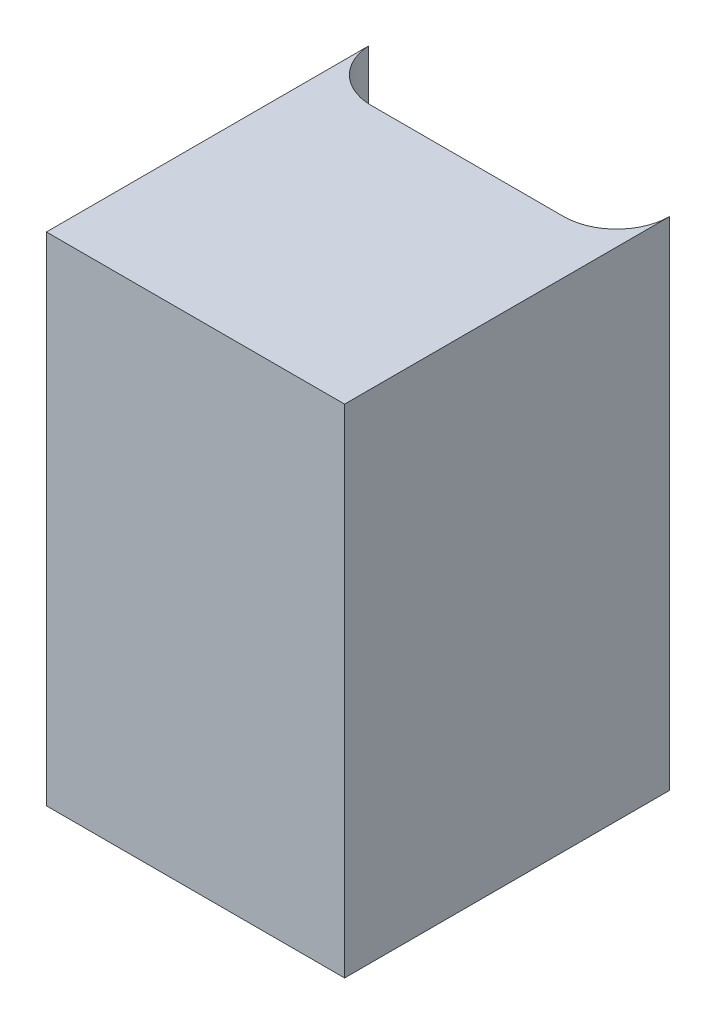
ISO-10303-21;
HEADER;
FILE_DESCRIPTION(('STEP AP214'),'2;1');
FILE_NAME('part.step','',(''),(''),'','','');
FILE_SCHEMA(('AUTOMOTIVE_DESIGN { 1 0 10303 214 1 1 1 1 }'));
ENDSEC;
DATA;
#1=APPLICATION_CONTEXT('core data for automotive mechanical design processes');
#2=APPLICATION_PROTOCOL_DEFINITION('international standard','automotive_design',2000,#1);
#3=PRODUCT_CONTEXT('',#1,'mechanical');
#4=PRODUCT('Part','Part','',(#3));
#5=PRODUCT_RELATED_PRODUCT_CATEGORY('part','',(#4));
#6=PRODUCT_DEFINITION_FORMATION('','',#4);
#7=PRODUCT_DEFINITION_CONTEXT('part definition',#1,'design');
#8=PRODUCT_DEFINITION('design','',#6,#7);
#9=PRODUCT_DEFINITION_SHAPE('','',#8);
#10=(LENGTH_UNIT() NAMED_UNIT(*) SI_UNIT(.MILLI.,.METRE.));
#11=(NAMED_UNIT(*) PLANE_ANGLE_UNIT() SI_UNIT($,.RADIAN.));
#12=(NAMED_UNIT(*) SI_UNIT($,.STERADIAN.) SOLID_ANGLE_UNIT());
#13=UNCERTAINTY_MEASURE_WITH_UNIT(LENGTH_MEASURE(1.E-05),#10,'distance_accuracy_value','');
#14=(GEOMETRIC_REPRESENTATION_CONTEXT(3) GLOBAL_UNCERTAINTY_ASSIGNED_CONTEXT((#13)) GLOBAL_UNIT_ASSIGNED_CONTEXT((#10,
#11,#12)) REPRESENTATION_CONTEXT('',''));
#15=CARTESIAN_POINT('',(0.,0.,0.));
#16=DIRECTION('',(0.,0.,1.));
#17=DIRECTION('',(1.,0.,0.));
#18=AXIS2_PLACEMENT_3D('',#15,#16,#17);
#19=CARTESIAN_POINT('',(18.,8.25056753821846,0.));
#20=DIRECTION('',(0.,-1.,0.));
#21=DIRECTION('',(0.,0.,-1.));
#22=AXIS2_PLACEMENT_3D('',#19,#20,#21);
#23=PLANE('',#22);
#24=DIRECTION('',(0.,0.,1.));
#25=VECTOR('',#24,1.);
#26=CARTESIAN_POINT('',(18.,8.25056753821846,0.));
#27=LINE('',#26,#25);
#28=CARTESIAN_POINT('',(18.,8.25056753821846,0.382236534697113));
#29=VERTEX_POINT('',#28);
#30=CARTESIAN_POINT('',(18.,8.25056753821846,20.));
#31=VERTEX_POINT('',#30);
#32=EDGE_CURVE('E86',#29,#31,#27,.T.);
#33=ORIENTED_EDGE('',*,*,#32,.F.);
#34=CARTESIAN_POINT('',(14.8,8.25056753821846,0.382236534697113));
#35=DIRECTION('',(0.,1.,0.));
#36=DIRECTION('',(0.,0.,1.));
#37=AXIS2_PLACEMENT_3D('',#34,#35,#36);
#38=CIRCLE('',#37,3.2);
#39=CARTESIAN_POINT('',(14.8,8.25056753821846,3.58223653469711));
#40=VERTEX_POINT('',#39);
#41=EDGE_CURVE('E103',#40,#29,#38,.T.);
#42=ORIENTED_EDGE('',*,*,#41,.F.);
#43=DIRECTION('',(1.,0.,0.));
#44=VECTOR('',#43,1.);
#45=CARTESIAN_POINT('',(3.19510252861408,8.25056753821846,3.58223653469711));
#46=LINE('',#45,#44);
#47=CARTESIAN_POINT('',(3.19510252861408,8.25056753821846,3.58223653469711));
#48=VERTEX_POINT('',#47);
#49=EDGE_CURVE('E106',#48,#40,#46,.T.);
#50=ORIENTED_EDGE('',*,*,#49,.F.);
#51=CARTESIAN_POINT('',(3.19510252861408,8.25056753821846,0.382236534697113));
#52=DIRECTION('',(0.,1.,0.));
#53=DIRECTION('',(0.,0.,1.));
#54=AXIS2_PLACEMENT_3D('',#51,#52,#53);
#55=CIRCLE('',#54,3.2);
#56=CARTESIAN_POINT('',(0.,8.25056753821846,0.55921063349098));
#57=VERTEX_POINT('',#56);
#58=EDGE_CURVE('E109',#57,#48,#55,.T.);
#59=ORIENTED_EDGE('',*,*,#58,.F.);
#60=DIRECTION('',(0.,0.,1.));
#61=VECTOR('',#60,1.);
#62=CARTESIAN_POINT('',(0.,8.25056753821846,0.));
#63=LINE('',#62,#61);
#64=CARTESIAN_POINT('',(0.,8.25056753821846,20.));
#65=VERTEX_POINT('',#64);
#66=EDGE_CURVE('E76',#57,#65,#63,.T.);
#67=ORIENTED_EDGE('',*,*,#66,.T.);
#68=DIRECTION('',(-1.,0.,0.));
#69=VECTOR('',#68,1.);
#70=CARTESIAN_POINT('',(18.,8.25056753821846,20.));
#71=LINE('',#70,#69);
#72=EDGE_CURVE('E38',#31,#65,#71,.T.);
#73=ORIENTED_EDGE('',*,*,#72,.F.);
#74=EDGE_LOOP('',(#33,#42,#50,#59,#67,#73));
#75=FACE_BOUND('',#74,.T.);
#76=ADVANCED_FACE('F31',(#75),#23,.F.);
#77=CARTESIAN_POINT('',(18.,8.25056753821846,20.));
#78=DIRECTION('',(0.,0.,-1.));
#79=DIRECTION('',(0.,1.,0.));
#80=AXIS2_PLACEMENT_3D('',#77,#78,#79);
#81=PLANE('',#80);
#82=DIRECTION('',(0.,-1.,0.));
#83=VECTOR('',#82,1.);
#84=CARTESIAN_POINT('',(0.,8.25056753821846,20.));
#85=LINE('',#84,#83);
#86=CARTESIAN_POINT('',(0.,-21.7494324617815,20.));
#87=VERTEX_POINT('',#86);
#88=EDGE_CURVE('E66',#65,#87,#85,.T.);
#89=ORIENTED_EDGE('',*,*,#88,.T.);
#90=DIRECTION('',(-1.,0.,0.));
#91=VECTOR('',#90,1.);
#92=CARTESIAN_POINT('',(18.,-21.7494324617815,20.));
#93=LINE('',#92,#91);
#94=CARTESIAN_POINT('',(18.,-21.7494324617815,20.));
#95=VERTEX_POINT('',#94);
#96=EDGE_CURVE('E69',#95,#87,#93,.T.);
#97=ORIENTED_EDGE('',*,*,#96,.F.);
#98=DIRECTION('',(0.,-1.,0.));
#99=VECTOR('',#98,1.);
#100=CARTESIAN_POINT('',(18.,8.25056753821846,20.));
#101=LINE('',#100,#99);
#102=EDGE_CURVE('E53',#31,#95,#101,.T.);
#103=ORIENTED_EDGE('',*,*,#102,.F.);
#104=ORIENTED_EDGE('',*,*,#72,.T.);
#105=EDGE_LOOP('',(#89,#97,#103,#104));
#106=FACE_BOUND('',#105,.T.);
#107=ADVANCED_FACE('F68',(#106),#81,.F.);
#108=CARTESIAN_POINT('',(18.,-21.7494324617815,0.));
#109=DIRECTION('',(0.,1.,0.));
#110=DIRECTION('',(0.,0.,1.));
#111=AXIS2_PLACEMENT_3D('',#108,#109,#110);
#112=PLANE('',#111);
#113=DIRECTION('',(1.,0.,0.));
#114=VECTOR('',#113,1.);
#115=CARTESIAN_POINT('',(3.19510252861408,-21.7494324617815,3.58223653469711));
#116=LINE('',#115,#114);
#117=CARTESIAN_POINT('',(3.19510252861408,-21.7494324617815,3.58223653469711));
#118=VERTEX_POINT('',#117);
#119=CARTESIAN_POINT('',(14.8,-21.7494324617815,3.58223653469711));
#120=VERTEX_POINT('',#119);
#121=EDGE_CURVE('E113',#118,#120,#116,.T.);
#122=ORIENTED_EDGE('',*,*,#121,.T.);
#123=CARTESIAN_POINT('',(14.8,-21.7494324617815,0.382236534697113));
#124=DIRECTION('',(0.,1.,0.));
#125=DIRECTION('',(0.,0.,1.));
#126=AXIS2_PLACEMENT_3D('',#123,#124,#125);
#127=CIRCLE('',#126,3.2);
#128=CARTESIAN_POINT('',(18.,-21.7494324617815,0.382236534697113));
#129=VERTEX_POINT('',#128);
#130=EDGE_CURVE('E98',#120,#129,#127,.T.);
#131=ORIENTED_EDGE('',*,*,#130,.T.);
#132=DIRECTION('',(0.,0.,-1.));
#133=VECTOR('',#132,1.);
#134=CARTESIAN_POINT('',(18.,-21.7494324617815,0.));
#135=LINE('',#134,#133);
#136=EDGE_CURVE('E83',#95,#129,#135,.T.);
#137=ORIENTED_EDGE('',*,*,#136,.F.);
#138=ORIENTED_EDGE('',*,*,#96,.T.);
#139=DIRECTION('',(0.,0.,-1.));
#140=VECTOR('',#139,1.);
#141=CARTESIAN_POINT('',(0.,-21.7494324617815,0.));
#142=LINE('',#141,#140);
#143=CARTESIAN_POINT('',(0.,-21.7494324617815,0.55921063349098));
#144=VERTEX_POINT('',#143);
#145=EDGE_CURVE('E75',#87,#144,#142,.T.);
#146=ORIENTED_EDGE('',*,*,#145,.T.);
#147=CARTESIAN_POINT('',(3.19510252861408,-21.7494324617815,0.382236534697113));
#148=DIRECTION('',(0.,1.,0.));
#149=DIRECTION('',(0.,0.,1.));
#150=AXIS2_PLACEMENT_3D('',#147,#148,#149);
#151=CIRCLE('',#150,3.2);
#152=EDGE_CURVE('E44',#144,#118,#151,.T.);
#153=ORIENTED_EDGE('',*,*,#152,.T.);
#154=EDGE_LOOP('',(#122,#131,#137,#138,#146,#153));
#155=FACE_BOUND('',#154,.T.);
#156=ADVANCED_FACE('F81',(#155),#112,.F.);
#157=CARTESIAN_POINT('',(18.,-21.7494324617815,0.));
#158=DIRECTION('',(-1.,0.,0.));
#159=DIRECTION('',(0.,0.,1.));
#160=AXIS2_PLACEMENT_3D('',#157,#158,#159);
#161=PLANE('',#160);
#162=ORIENTED_EDGE('',*,*,#136,.T.);
#163=DIRECTION('',(0.,1.,0.));
#164=VECTOR('',#163,1.);
#165=CARTESIAN_POINT('',(18.,-21.7494324617815,0.382236534697113));
#166=LINE('',#165,#164);
#167=EDGE_CURVE('E91',#129,#29,#166,.T.);
#168=ORIENTED_EDGE('',*,*,#167,.T.);
#169=ORIENTED_EDGE('',*,*,#32,.T.);
#170=ORIENTED_EDGE('',*,*,#102,.T.);
#171=EDGE_LOOP('',(#162,#168,#169,#170));
#172=FACE_BOUND('',#171,.T.);
#173=ADVANCED_FACE('F141',(#172),#161,.F.);
#174=CARTESIAN_POINT('',(0.,-21.7494324617815,0.));
#175=DIRECTION('',(-1.,0.,0.));
#176=DIRECTION('',(0.,0.,1.));
#177=AXIS2_PLACEMENT_3D('',#174,#175,#176);
#178=PLANE('',#177);
#179=DIRECTION('',(0.,1.,0.));
#180=VECTOR('',#179,1.);
#181=CARTESIAN_POINT('',(0.,-21.7494324617815,0.55921063349098));
#182=LINE('',#181,#180);
#183=EDGE_CURVE('E11',#144,#57,#182,.T.);
#184=ORIENTED_EDGE('',*,*,#183,.F.);
#185=ORIENTED_EDGE('',*,*,#145,.F.);
#186=ORIENTED_EDGE('',*,*,#88,.F.);
#187=ORIENTED_EDGE('',*,*,#66,.F.);
#188=EDGE_LOOP('',(#184,#185,#186,#187));
#189=FACE_BOUND('',#188,.T.);
#190=ADVANCED_FACE('F85',(#189),#178,.T.);
#191=CARTESIAN_POINT('',(14.8,-21.7494324617815,0.382236534697113));
#192=DIRECTION('',(0.,1.,0.));
#193=DIRECTION('',(0.,0.,1.));
#194=AXIS2_PLACEMENT_3D('',#191,#192,#193);
#195=CYLINDRICAL_SURFACE('',#194,3.2);
#196=ORIENTED_EDGE('',*,*,#41,.T.);
#197=ORIENTED_EDGE('',*,*,#167,.F.);
#198=ORIENTED_EDGE('',*,*,#130,.F.);
#199=DIRECTION('',(0.,1.,0.));
#200=VECTOR('',#199,1.);
#201=CARTESIAN_POINT('',(14.8,-21.7494324617815,3.58223653469711));
#202=LINE('',#201,#200);
#203=EDGE_CURVE('E97',#120,#40,#202,.T.);
#204=ORIENTED_EDGE('',*,*,#203,.T.);
#205=EDGE_LOOP('',(#196,#197,#198,#204));
#206=FACE_BOUND('',#205,.T.);
#207=ADVANCED_FACE('F140',(#206),#195,.F.);
#208=CARTESIAN_POINT('',(3.19510252861408,-21.7494324617815,3.58223653469711));
#209=DIRECTION('',(0.,0.,1.));
#210=DIRECTION('',(1.,0.,0.));
#211=AXIS2_PLACEMENT_3D('',#208,#209,#210);
#212=PLANE('',#211);
#213=ORIENTED_EDGE('',*,*,#49,.T.);
#214=ORIENTED_EDGE('',*,*,#203,.F.);
#215=ORIENTED_EDGE('',*,*,#121,.F.);
#216=DIRECTION('',(0.,1.,0.));
#217=VECTOR('',#216,1.);
#218=CARTESIAN_POINT('',(3.19510252861408,-21.7494324617815,3.58223653469711));
#219=LINE('',#218,#217);
#220=EDGE_CURVE('E94',#118,#48,#219,.T.);
#221=ORIENTED_EDGE('',*,*,#220,.T.);
#222=EDGE_LOOP('',(#213,#214,#215,#221));
#223=FACE_BOUND('',#222,.T.);
#224=ADVANCED_FACE('F137',(#223),#212,.F.);
#225=CARTESIAN_POINT('',(3.19510252861408,-21.7494324617815,0.382236534697113));
#226=DIRECTION('',(0.,1.,0.));
#227=DIRECTION('',(0.,0.,1.));
#228=AXIS2_PLACEMENT_3D('',#225,#226,#227);
#229=CYLINDRICAL_SURFACE('',#228,3.2);
#230=ORIENTED_EDGE('',*,*,#183,.T.);
#231=ORIENTED_EDGE('',*,*,#58,.T.);
#232=ORIENTED_EDGE('',*,*,#220,.F.);
#233=ORIENTED_EDGE('',*,*,#152,.F.);
#234=EDGE_LOOP('',(#230,#231,#232,#233));
#235=FACE_BOUND('',#234,.T.);
#236=ADVANCED_FACE('F131',(#235),#229,.F.);
#237=CLOSED_SHELL('',(#76,#107,#156,#173,#190,#207,#224,#236));
#238=MANIFOLD_SOLID_BREP('B2',#237);
#239=ADVANCED_BREP_SHAPE_REPRESENTATION('',(#18,#238),#14);
#240=SHAPE_DEFINITION_REPRESENTATION(#9,#239);
ENDSEC;
END-ISO-10303-21;
